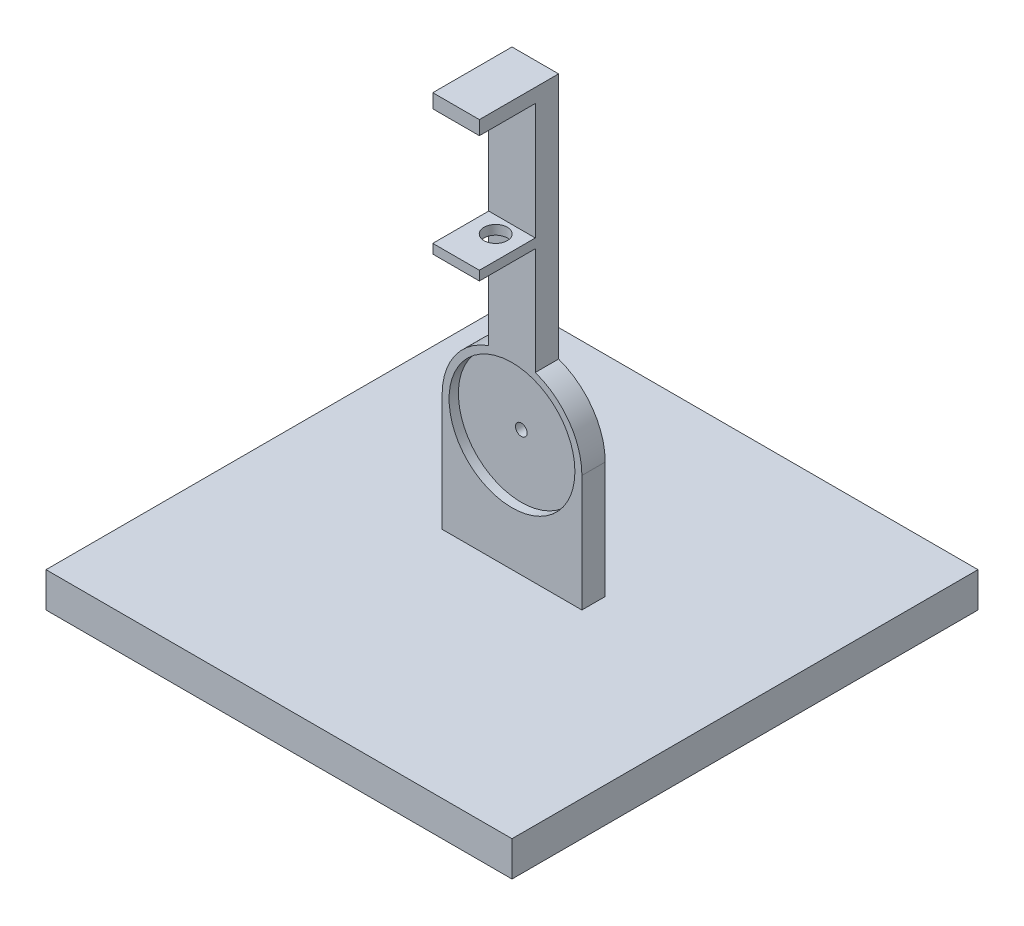
ISO-10303-21;
HEADER;
FILE_DESCRIPTION(('STEP AP214'),'2;1');
FILE_NAME('part.step','',(''),(''),'','','');
FILE_SCHEMA(('AUTOMOTIVE_DESIGN { 1 0 10303 214 1 1 1 1 }'));
ENDSEC;
DATA;
#1=APPLICATION_CONTEXT('core data for automotive mechanical design processes');
#2=APPLICATION_PROTOCOL_DEFINITION('international standard','automotive_design',2000,#1);
#3=PRODUCT_CONTEXT('',#1,'mechanical');
#4=PRODUCT('Part','Part','',(#3));
#5=PRODUCT_RELATED_PRODUCT_CATEGORY('part','',(#4));
#6=PRODUCT_DEFINITION_FORMATION('','',#4);
#7=PRODUCT_DEFINITION_CONTEXT('part definition',#1,'design');
#8=PRODUCT_DEFINITION('design','',#6,#7);
#9=PRODUCT_DEFINITION_SHAPE('','',#8);
#10=(LENGTH_UNIT() NAMED_UNIT(*) SI_UNIT(.MILLI.,.METRE.));
#11=(NAMED_UNIT(*) PLANE_ANGLE_UNIT() SI_UNIT($,.RADIAN.));
#12=(NAMED_UNIT(*) SI_UNIT($,.STERADIAN.) SOLID_ANGLE_UNIT());
#13=UNCERTAINTY_MEASURE_WITH_UNIT(LENGTH_MEASURE(1.E-05),#10,'distance_accuracy_value','');
#14=(GEOMETRIC_REPRESENTATION_CONTEXT(3) GLOBAL_UNCERTAINTY_ASSIGNED_CONTEXT((#13)) GLOBAL_UNIT_ASSIGNED_CONTEXT((#10,
#11,#12)) REPRESENTATION_CONTEXT('',''));
#15=CARTESIAN_POINT('',(0.,0.,0.));
#16=DIRECTION('',(0.,0.,1.));
#17=DIRECTION('',(1.,0.,0.));
#18=AXIS2_PLACEMENT_3D('',#15,#16,#17);
#19=CARTESIAN_POINT('',(50.,32.5,50.));
#20=DIRECTION('',(0.,0.,-1.));
#21=DIRECTION('',(-1.,0.,0.));
#22=AXIS2_PLACEMENT_3D('',#19,#20,#21);
#23=PLANE('',#22);
#24=DIRECTION('',(1.,0.,0.));
#25=VECTOR('',#24,1.);
#26=CARTESIAN_POINT('',(0.,71.642135623731,50.));
#27=LINE('',#26,#25);
#28=CARTESIAN_POINT('',(45.,71.642135623731,50.));
#29=VERTEX_POINT('',#28);
#30=CARTESIAN_POINT('',(55.,71.642135623731,50.));
#31=VERTEX_POINT('',#30);
#32=EDGE_CURVE('E64',#29,#31,#27,.T.);
#33=ORIENTED_EDGE('',*,*,#32,.T.);
#34=DIRECTION('',(0.,1.,0.));
#35=VECTOR('',#34,1.);
#36=CARTESIAN_POINT('',(55.,46.642135623731,50.));
#37=LINE('',#36,#35);
#38=CARTESIAN_POINT('',(55.,96.642135623731,50.));
#39=VERTEX_POINT('',#38);
#40=EDGE_CURVE('E236',#31,#39,#37,.T.);
#41=ORIENTED_EDGE('',*,*,#40,.T.);
#42=DIRECTION('',(1.,0.,0.));
#43=VECTOR('',#42,1.);
#44=CARTESIAN_POINT('',(45.,96.642135623731,50.));
#45=LINE('',#44,#43);
#46=CARTESIAN_POINT('',(45.,96.642135623731,50.));
#47=VERTEX_POINT('',#46);
#48=EDGE_CURVE('E239',#47,#39,#45,.T.);
#49=ORIENTED_EDGE('',*,*,#48,.F.);
#50=DIRECTION('',(0.,1.,0.));
#51=VECTOR('',#50,1.);
#52=CARTESIAN_POINT('',(45.,46.642135623731,50.));
#53=LINE('',#52,#51);
#54=EDGE_CURVE('E242',#29,#47,#53,.T.);
#55=ORIENTED_EDGE('',*,*,#54,.F.);
#56=EDGE_LOOP('',(#33,#41,#49,#55));
#57=FACE_BOUND('',#56,.T.);
#58=ADVANCED_FACE('F39',(#57),#23,.F.);
#59=CARTESIAN_POINT('',(0.,7.5,100.));
#60=DIRECTION('',(0.,1.,0.));
#61=DIRECTION('',(0.,0.,1.));
#62=AXIS2_PLACEMENT_3D('',#59,#60,#61);
#63=PLANE('',#62);
#64=DIRECTION('',(1.,0.,0.));
#65=VECTOR('',#64,1.);
#66=CARTESIAN_POINT('',(0.,7.5,0.));
#67=LINE('',#66,#65);
#68=CARTESIAN_POINT('',(0.,7.5,0.));
#69=VERTEX_POINT('',#68);
#70=CARTESIAN_POINT('',(100.,7.5,0.));
#71=VERTEX_POINT('',#70);
#72=EDGE_CURVE('E293',#69,#71,#67,.T.);
#73=ORIENTED_EDGE('',*,*,#72,.F.);
#74=DIRECTION('',(0.,0.,-1.));
#75=VECTOR('',#74,1.);
#76=CARTESIAN_POINT('',(0.,7.5,100.));
#77=LINE('',#76,#75);
#78=CARTESIAN_POINT('',(0.,7.5,100.));
#79=VERTEX_POINT('',#78);
#80=EDGE_CURVE('E43',#79,#69,#77,.T.);
#81=ORIENTED_EDGE('',*,*,#80,.F.);
#82=DIRECTION('',(1.,0.,0.));
#83=VECTOR('',#82,1.);
#84=CARTESIAN_POINT('',(0.,7.5,100.));
#85=LINE('',#84,#83);
#86=CARTESIAN_POINT('',(100.,7.5,100.));
#87=VERTEX_POINT('',#86);
#88=EDGE_CURVE('E283',#79,#87,#85,.T.);
#89=ORIENTED_EDGE('',*,*,#88,.T.);
#90=DIRECTION('',(0.,0.,-1.));
#91=VECTOR('',#90,1.);
#92=CARTESIAN_POINT('',(100.,7.5,100.));
#93=LINE('',#92,#91);
#94=EDGE_CURVE('E301',#87,#71,#93,.T.);
#95=ORIENTED_EDGE('',*,*,#94,.T.);
#96=EDGE_LOOP('',(#73,#81,#89,#95));
#97=FACE_BOUND('',#96,.T.);
#98=DIRECTION('',(0.,0.,-1.));
#99=VECTOR('',#98,1.);
#100=CARTESIAN_POINT('',(65.,7.5,50.));
#101=LINE('',#100,#99);
#102=CARTESIAN_POINT('',(65.,7.5,50.));
#103=VERTEX_POINT('',#102);
#104=CARTESIAN_POINT('',(65.,7.5,45.));
#105=VERTEX_POINT('',#104);
#106=EDGE_CURVE('E276',#103,#105,#101,.T.);
#107=ORIENTED_EDGE('',*,*,#106,.F.);
#108=DIRECTION('',(1.,0.,0.));
#109=VECTOR('',#108,1.);
#110=CARTESIAN_POINT('',(35.,7.5,50.));
#111=LINE('',#110,#109);
#112=CARTESIAN_POINT('',(35.,7.5,50.));
#113=VERTEX_POINT('',#112);
#114=EDGE_CURVE('E227',#113,#103,#111,.T.);
#115=ORIENTED_EDGE('',*,*,#114,.F.);
#116=DIRECTION('',(0.,0.,-1.));
#117=VECTOR('',#116,1.);
#118=CARTESIAN_POINT('',(35.,7.5,50.));
#119=LINE('',#118,#117);
#120=CARTESIAN_POINT('',(35.,7.5,45.));
#121=VERTEX_POINT('',#120);
#122=EDGE_CURVE('E250',#113,#121,#119,.T.);
#123=ORIENTED_EDGE('',*,*,#122,.T.);
#124=DIRECTION('',(1.,0.,0.));
#125=VECTOR('',#124,1.);
#126=CARTESIAN_POINT('',(35.,7.5,45.));
#127=LINE('',#126,#125);
#128=EDGE_CURVE('E224',#121,#105,#127,.T.);
#129=ORIENTED_EDGE('',*,*,#128,.T.);
#130=EDGE_LOOP('',(#107,#115,#123,#129));
#131=FACE_BOUND('',#130,.T.);
#132=ADVANCED_FACE('F309',(#97,#131),#63,.T.);
#133=CARTESIAN_POINT('',(0.,0.,100.));
#134=DIRECTION('',(-1.,0.,0.));
#135=DIRECTION('',(0.,0.,1.));
#136=AXIS2_PLACEMENT_3D('',#133,#134,#135);
#137=PLANE('',#136);
#138=DIRECTION('',(0.,1.,0.));
#139=VECTOR('',#138,1.);
#140=CARTESIAN_POINT('',(0.,0.,0.));
#141=LINE('',#140,#139);
#142=CARTESIAN_POINT('',(0.,0.,0.));
#143=VERTEX_POINT('',#142);
#144=EDGE_CURVE('E279',#143,#69,#141,.T.);
#145=ORIENTED_EDGE('',*,*,#144,.F.);
#146=DIRECTION('',(0.,0.,-1.));
#147=VECTOR('',#146,1.);
#148=CARTESIAN_POINT('',(0.,0.,100.));
#149=LINE('',#148,#147);
#150=CARTESIAN_POINT('',(0.,0.,100.));
#151=VERTEX_POINT('',#150);
#152=EDGE_CURVE('E11',#151,#143,#149,.T.);
#153=ORIENTED_EDGE('',*,*,#152,.F.);
#154=DIRECTION('',(0.,1.,0.));
#155=VECTOR('',#154,1.);
#156=CARTESIAN_POINT('',(0.,0.,100.));
#157=LINE('',#156,#155);
#158=EDGE_CURVE('E280',#151,#79,#157,.T.);
#159=ORIENTED_EDGE('',*,*,#158,.T.);
#160=ORIENTED_EDGE('',*,*,#80,.T.);
#161=EDGE_LOOP('',(#145,#153,#159,#160));
#162=FACE_BOUND('',#161,.T.);
#163=ADVANCED_FACE('F41',(#162),#137,.T.);
#164=CARTESIAN_POINT('',(0.,0.,100.));
#165=DIRECTION('',(0.,1.,0.));
#166=DIRECTION('',(0.,0.,1.));
#167=AXIS2_PLACEMENT_3D('',#164,#165,#166);
#168=PLANE('',#167);
#169=DIRECTION('',(1.,0.,0.));
#170=VECTOR('',#169,1.);
#171=CARTESIAN_POINT('',(0.,0.,0.));
#172=LINE('',#171,#170);
#173=CARTESIAN_POINT('',(100.,0.,0.));
#174=VERTEX_POINT('',#173);
#175=EDGE_CURVE('E284',#143,#174,#172,.T.);
#176=ORIENTED_EDGE('',*,*,#175,.T.);
#177=DIRECTION('',(0.,0.,-1.));
#178=VECTOR('',#177,1.);
#179=CARTESIAN_POINT('',(100.,0.,100.));
#180=LINE('',#179,#178);
#181=CARTESIAN_POINT('',(100.,0.,100.));
#182=VERTEX_POINT('',#181);
#183=EDGE_CURVE('E48',#182,#174,#180,.T.);
#184=ORIENTED_EDGE('',*,*,#183,.F.);
#185=DIRECTION('',(1.,0.,0.));
#186=VECTOR('',#185,1.);
#187=CARTESIAN_POINT('',(0.,0.,100.));
#188=LINE('',#187,#186);
#189=EDGE_CURVE('E289',#151,#182,#188,.T.);
#190=ORIENTED_EDGE('',*,*,#189,.F.);
#191=ORIENTED_EDGE('',*,*,#152,.T.);
#192=EDGE_LOOP('',(#176,#184,#190,#191));
#193=FACE_BOUND('',#192,.T.);
#194=ADVANCED_FACE('F317',(#193),#168,.F.);
#195=CARTESIAN_POINT('',(100.,0.,100.));
#196=DIRECTION('',(-1.,0.,0.));
#197=DIRECTION('',(0.,0.,1.));
#198=AXIS2_PLACEMENT_3D('',#195,#196,#197);
#199=PLANE('',#198);
#200=DIRECTION('',(0.,1.,0.));
#201=VECTOR('',#200,1.);
#202=CARTESIAN_POINT('',(100.,0.,0.));
#203=LINE('',#202,#201);
#204=EDGE_CURVE('E296',#174,#71,#203,.T.);
#205=ORIENTED_EDGE('',*,*,#204,.T.);
#206=ORIENTED_EDGE('',*,*,#94,.F.);
#207=DIRECTION('',(0.,1.,0.));
#208=VECTOR('',#207,1.);
#209=CARTESIAN_POINT('',(100.,0.,100.));
#210=LINE('',#209,#208);
#211=EDGE_CURVE('E287',#182,#87,#210,.T.);
#212=ORIENTED_EDGE('',*,*,#211,.F.);
#213=ORIENTED_EDGE('',*,*,#183,.T.);
#214=EDGE_LOOP('',(#205,#206,#212,#213));
#215=FACE_BOUND('',#214,.T.);
#216=ADVANCED_FACE('F321',(#215),#199,.F.);
#217=CARTESIAN_POINT('',(0.,0.,100.));
#218=DIRECTION('',(0.,0.,-1.));
#219=DIRECTION('',(-1.,0.,0.));
#220=AXIS2_PLACEMENT_3D('',#217,#218,#219);
#221=PLANE('',#220);
#222=ORIENTED_EDGE('',*,*,#158,.F.);
#223=ORIENTED_EDGE('',*,*,#189,.T.);
#224=ORIENTED_EDGE('',*,*,#211,.T.);
#225=ORIENTED_EDGE('',*,*,#88,.F.);
#226=EDGE_LOOP('',(#222,#223,#224,#225));
#227=FACE_BOUND('',#226,.T.);
#228=ADVANCED_FACE('F323',(#227),#221,.F.);
#229=CARTESIAN_POINT('',(0.,0.,0.));
#230=DIRECTION('',(0.,0.,-1.));
#231=DIRECTION('',(-1.,0.,0.));
#232=AXIS2_PLACEMENT_3D('',#229,#230,#231);
#233=PLANE('',#232);
#234=ORIENTED_EDGE('',*,*,#144,.T.);
#235=ORIENTED_EDGE('',*,*,#72,.T.);
#236=ORIENTED_EDGE('',*,*,#204,.F.);
#237=ORIENTED_EDGE('',*,*,#175,.F.);
#238=EDGE_LOOP('',(#234,#235,#236,#237));
#239=FACE_BOUND('',#238,.T.);
#240=ADVANCED_FACE('F314',(#239),#233,.T.);
#241=CARTESIAN_POINT('',(65.,7.5,50.));
#242=DIRECTION('',(-1.,0.,0.));
#243=DIRECTION('',(0.,0.,1.));
#244=AXIS2_PLACEMENT_3D('',#241,#242,#243);
#245=PLANE('',#244);
#246=DIRECTION('',(0.,1.,0.));
#247=VECTOR('',#246,1.);
#248=CARTESIAN_POINT('',(65.,7.5,45.));
#249=LINE('',#248,#247);
#250=CARTESIAN_POINT('',(65.,32.5,45.));
#251=VERTEX_POINT('',#250);
#252=EDGE_CURVE('E252',#105,#251,#249,.T.);
#253=ORIENTED_EDGE('',*,*,#252,.T.);
#254=DIRECTION('',(0.,0.,-1.));
#255=VECTOR('',#254,1.);
#256=CARTESIAN_POINT('',(65.,32.5,50.));
#257=LINE('',#256,#255);
#258=CARTESIAN_POINT('',(65.,32.5,50.));
#259=VERTEX_POINT('',#258);
#260=EDGE_CURVE('E274',#259,#251,#257,.T.);
#261=ORIENTED_EDGE('',*,*,#260,.F.);
#262=DIRECTION('',(0.,1.,0.));
#263=VECTOR('',#262,1.);
#264=CARTESIAN_POINT('',(65.,7.5,50.));
#265=LINE('',#264,#263);
#266=EDGE_CURVE('E230',#103,#259,#265,.T.);
#267=ORIENTED_EDGE('',*,*,#266,.F.);
#268=ORIENTED_EDGE('',*,*,#106,.T.);
#269=EDGE_LOOP('',(#253,#261,#267,#268));
#270=FACE_BOUND('',#269,.T.);
#271=ADVANCED_FACE('F330',(#270),#245,.F.);
#272=CARTESIAN_POINT('',(50.,32.5,50.));
#273=DIRECTION('',(0.,0.,-1.));
#274=DIRECTION('',(-1.,0.,0.));
#275=AXIS2_PLACEMENT_3D('',#272,#273,#274);
#276=CYLINDRICAL_SURFACE('',#275,15.);
#277=CARTESIAN_POINT('',(50.,32.5,45.));
#278=DIRECTION('',(0.,0.,-1.));
#279=DIRECTION('',(-1.,0.,0.));
#280=AXIS2_PLACEMENT_3D('',#277,#278,#279);
#281=CIRCLE('',#280,15.);
#282=CARTESIAN_POINT('',(55.,46.642135623731,45.));
#283=VERTEX_POINT('',#282);
#284=EDGE_CURVE('E255',#283,#251,#281,.T.);
#285=ORIENTED_EDGE('',*,*,#284,.F.);
#286=DIRECTION('',(0.,0.,-1.));
#287=VECTOR('',#286,1.);
#288=CARTESIAN_POINT('',(55.,46.642135623731,50.));
#289=LINE('',#288,#287);
#290=CARTESIAN_POINT('',(55.,46.642135623731,50.));
#291=VERTEX_POINT('',#290);
#292=EDGE_CURVE('E272',#291,#283,#289,.T.);
#293=ORIENTED_EDGE('',*,*,#292,.F.);
#294=CARTESIAN_POINT('',(50.,32.5,50.));
#295=DIRECTION('',(0.,0.,-1.));
#296=DIRECTION('',(-1.,0.,0.));
#297=AXIS2_PLACEMENT_3D('',#294,#295,#296);
#298=CIRCLE('',#297,15.);
#299=EDGE_CURVE('E233',#291,#259,#298,.T.);
#300=ORIENTED_EDGE('',*,*,#299,.T.);
#301=ORIENTED_EDGE('',*,*,#260,.T.);
#302=EDGE_LOOP('',(#285,#293,#300,#301));
#303=FACE_BOUND('',#302,.T.);
#304=ADVANCED_FACE('F445',(#303),#276,.T.);
#305=CARTESIAN_POINT('',(55.,46.642135623731,50.));
#306=DIRECTION('',(-1.,0.,0.));
#307=DIRECTION('',(0.,0.,1.));
#308=AXIS2_PLACEMENT_3D('',#305,#306,#307);
#309=PLANE('',#308);
#310=DIRECTION('',(0.,1.,0.));
#311=VECTOR('',#310,1.);
#312=CARTESIAN_POINT('',(55.,46.642135623731,45.));
#313=LINE('',#312,#311);
#314=CARTESIAN_POINT('',(55.,99.642135623731,45.));
#315=VERTEX_POINT('',#314);
#316=EDGE_CURVE('E258',#283,#315,#313,.T.);
#317=ORIENTED_EDGE('',*,*,#316,.T.);
#318=DIRECTION('',(0.,0.,-1.));
#319=VECTOR('',#318,1.);
#320=CARTESIAN_POINT('',(55.,99.642135623731,62.));
#321=LINE('',#320,#319);
#322=CARTESIAN_POINT('',(55.,99.642135623731,62.));
#323=VERTEX_POINT('',#322);
#324=EDGE_CURVE('E217',#323,#315,#321,.T.);
#325=ORIENTED_EDGE('',*,*,#324,.F.);
#326=DIRECTION('',(0.,1.,0.));
#327=VECTOR('',#326,1.);
#328=CARTESIAN_POINT('',(55.,96.642135623731,62.));
#329=LINE('',#328,#327);
#330=CARTESIAN_POINT('',(55.,96.642135623731,62.));
#331=VERTEX_POINT('',#330);
#332=EDGE_CURVE('E193',#331,#323,#329,.T.);
#333=ORIENTED_EDGE('',*,*,#332,.F.);
#334=DIRECTION('',(0.,0.,-1.));
#335=VECTOR('',#334,1.);
#336=CARTESIAN_POINT('',(55.,96.642135623731,62.));
#337=LINE('',#336,#335);
#338=EDGE_CURVE('E207',#331,#39,#337,.T.);
#339=ORIENTED_EDGE('',*,*,#338,.T.);
#340=ORIENTED_EDGE('',*,*,#40,.F.);
#341=DIRECTION('',(0.,0.,-1.));
#342=VECTOR('',#341,1.);
#343=CARTESIAN_POINT('',(55.,71.642135623731,0.));
#344=LINE('',#343,#342);
#345=CARTESIAN_POINT('',(55.,71.642135623731,62.));
#346=VERTEX_POINT('',#345);
#347=EDGE_CURVE('E371',#346,#31,#344,.T.);
#348=ORIENTED_EDGE('',*,*,#347,.F.);
#349=DIRECTION('',(0.,1.,0.));
#350=VECTOR('',#349,1.);
#351=CARTESIAN_POINT('',(55.,69.642135623731,62.));
#352=LINE('',#351,#350);
#353=CARTESIAN_POINT('',(55.,69.642135623731,62.));
#354=VERTEX_POINT('',#353);
#355=EDGE_CURVE('E190',#354,#346,#352,.T.);
#356=ORIENTED_EDGE('',*,*,#355,.F.);
#357=DIRECTION('',(0.,0.,-1.));
#358=VECTOR('',#357,1.);
#359=CARTESIAN_POINT('',(55.,69.642135623731,0.));
#360=LINE('',#359,#358);
#361=CARTESIAN_POINT('',(55.,69.642135623731,50.));
#362=VERTEX_POINT('',#361);
#363=EDGE_CURVE('E182',#354,#362,#360,.T.);
#364=ORIENTED_EDGE('',*,*,#363,.T.);
#365=EDGE_CURVE('E237',#291,#362,#37,.T.);
#366=ORIENTED_EDGE('',*,*,#365,.F.);
#367=ORIENTED_EDGE('',*,*,#292,.T.);
#368=EDGE_LOOP('',(#317,#325,#333,#339,#340,#348,#356,#364,#366,#367));
#369=FACE_BOUND('',#368,.T.);
#370=ADVANCED_FACE('F360',(#369),#309,.F.);
#371=CARTESIAN_POINT('',(45.,46.642135623731,50.));
#372=DIRECTION('',(-1.,0.,0.));
#373=DIRECTION('',(0.,-1.,0.));
#374=AXIS2_PLACEMENT_3D('',#371,#372,#373);
#375=PLANE('',#374);
#376=DIRECTION('',(0.,1.,0.));
#377=VECTOR('',#376,1.);
#378=CARTESIAN_POINT('',(45.,46.642135623731,45.));
#379=LINE('',#378,#377);
#380=CARTESIAN_POINT('',(45.,46.642135623731,45.));
#381=VERTEX_POINT('',#380);
#382=CARTESIAN_POINT('',(45.,99.642135623731,45.));
#383=VERTEX_POINT('',#382);
#384=EDGE_CURVE('E260',#381,#383,#379,.T.);
#385=ORIENTED_EDGE('',*,*,#384,.F.);
#386=DIRECTION('',(0.,0.,-1.));
#387=VECTOR('',#386,1.);
#388=CARTESIAN_POINT('',(45.,46.642135623731,50.));
#389=LINE('',#388,#387);
#390=CARTESIAN_POINT('',(45.,46.642135623731,50.));
#391=VERTEX_POINT('',#390);
#392=EDGE_CURVE('E270',#391,#381,#389,.T.);
#393=ORIENTED_EDGE('',*,*,#392,.F.);
#394=CARTESIAN_POINT('',(45.,69.642135623731,50.));
#395=VERTEX_POINT('',#394);
#396=EDGE_CURVE('E174',#391,#395,#53,.T.);
#397=ORIENTED_EDGE('',*,*,#396,.T.);
#398=DIRECTION('',(0.,0.,-1.));
#399=VECTOR('',#398,1.);
#400=CARTESIAN_POINT('',(45.,69.642135623731,0.));
#401=LINE('',#400,#399);
#402=CARTESIAN_POINT('',(45.,69.642135623731,62.));
#403=VERTEX_POINT('',#402);
#404=EDGE_CURVE('E166',#403,#395,#401,.T.);
#405=ORIENTED_EDGE('',*,*,#404,.F.);
#406=DIRECTION('',(0.,1.,0.));
#407=VECTOR('',#406,1.);
#408=CARTESIAN_POINT('',(45.,69.642135623731,62.));
#409=LINE('',#408,#407);
#410=CARTESIAN_POINT('',(45.,71.642135623731,62.));
#411=VERTEX_POINT('',#410);
#412=EDGE_CURVE('E172',#403,#411,#409,.T.);
#413=ORIENTED_EDGE('',*,*,#412,.T.);
#414=DIRECTION('',(0.,0.,-1.));
#415=VECTOR('',#414,1.);
#416=CARTESIAN_POINT('',(45.,71.642135623731,0.));
#417=LINE('',#416,#415);
#418=EDGE_CURVE('E369',#411,#29,#417,.T.);
#419=ORIENTED_EDGE('',*,*,#418,.T.);
#420=ORIENTED_EDGE('',*,*,#54,.T.);
#421=DIRECTION('',(0.,0.,-1.));
#422=VECTOR('',#421,1.);
#423=CARTESIAN_POINT('',(45.,96.642135623731,62.));
#424=LINE('',#423,#422);
#425=CARTESIAN_POINT('',(45.,96.642135623731,62.));
#426=VERTEX_POINT('',#425);
#427=EDGE_CURVE('E211',#426,#47,#424,.T.);
#428=ORIENTED_EDGE('',*,*,#427,.F.);
#429=DIRECTION('',(0.,1.,0.));
#430=VECTOR('',#429,1.);
#431=CARTESIAN_POINT('',(45.,96.642135623731,62.));
#432=LINE('',#431,#430);
#433=CARTESIAN_POINT('',(45.,99.642135623731,62.));
#434=VERTEX_POINT('',#433);
#435=EDGE_CURVE('E202',#426,#434,#432,.T.);
#436=ORIENTED_EDGE('',*,*,#435,.T.);
#437=DIRECTION('',(0.,0.,-1.));
#438=VECTOR('',#437,1.);
#439=CARTESIAN_POINT('',(45.,99.642135623731,62.));
#440=LINE('',#439,#438);
#441=EDGE_CURVE('E214',#434,#383,#440,.T.);
#442=ORIENTED_EDGE('',*,*,#441,.T.);
#443=EDGE_LOOP('',(#385,#393,#397,#405,#413,#419,#420,#428,#436,#442));
#444=FACE_BOUND('',#443,.T.);
#445=ADVANCED_FACE('F169',(#444),#375,.T.);
#446=CARTESIAN_POINT('',(50.,32.5,50.));
#447=DIRECTION('',(0.,0.,-1.));
#448=DIRECTION('',(-1.,0.,0.));
#449=AXIS2_PLACEMENT_3D('',#446,#447,#448);
#450=CYLINDRICAL_SURFACE('',#449,15.);
#451=CARTESIAN_POINT('',(50.,32.5,45.));
#452=DIRECTION('',(0.,0.,-1.));
#453=DIRECTION('',(-1.,0.,0.));
#454=AXIS2_PLACEMENT_3D('',#451,#452,#453);
#455=CIRCLE('',#454,15.);
#456=CARTESIAN_POINT('',(35.,32.5,45.));
#457=VERTEX_POINT('',#456);
#458=EDGE_CURVE('E262',#457,#381,#455,.T.);
#459=ORIENTED_EDGE('',*,*,#458,.F.);
#460=DIRECTION('',(0.,0.,-1.));
#461=VECTOR('',#460,1.);
#462=CARTESIAN_POINT('',(35.,32.5,50.));
#463=LINE('',#462,#461);
#464=CARTESIAN_POINT('',(35.,32.5,50.));
#465=VERTEX_POINT('',#464);
#466=EDGE_CURVE('E268',#465,#457,#463,.T.);
#467=ORIENTED_EDGE('',*,*,#466,.F.);
#468=CARTESIAN_POINT('',(50.,32.5,50.));
#469=DIRECTION('',(0.,0.,-1.));
#470=DIRECTION('',(-1.,0.,0.));
#471=AXIS2_PLACEMENT_3D('',#468,#469,#470);
#472=CIRCLE('',#471,15.);
#473=EDGE_CURVE('E244',#465,#391,#472,.T.);
#474=ORIENTED_EDGE('',*,*,#473,.T.);
#475=ORIENTED_EDGE('',*,*,#392,.T.);
#476=EDGE_LOOP('',(#459,#467,#474,#475));
#477=FACE_BOUND('',#476,.T.);
#478=ADVANCED_FACE('F352',(#477),#450,.T.);
#479=CARTESIAN_POINT('',(35.,7.5,50.));
#480=DIRECTION('',(-1.,0.,0.));
#481=DIRECTION('',(0.,0.,1.));
#482=AXIS2_PLACEMENT_3D('',#479,#480,#481);
#483=PLANE('',#482);
#484=DIRECTION('',(0.,1.,0.));
#485=VECTOR('',#484,1.);
#486=CARTESIAN_POINT('',(35.,7.5,45.));
#487=LINE('',#486,#485);
#488=EDGE_CURVE('E231',#121,#457,#487,.T.);
#489=ORIENTED_EDGE('',*,*,#488,.F.);
#490=ORIENTED_EDGE('',*,*,#122,.F.);
#491=DIRECTION('',(0.,1.,0.));
#492=VECTOR('',#491,1.);
#493=CARTESIAN_POINT('',(35.,7.5,50.));
#494=LINE('',#493,#492);
#495=EDGE_CURVE('E247',#113,#465,#494,.T.);
#496=ORIENTED_EDGE('',*,*,#495,.T.);
#497=ORIENTED_EDGE('',*,*,#466,.T.);
#498=EDGE_LOOP('',(#489,#490,#496,#497));
#499=FACE_BOUND('',#498,.T.);
#500=ADVANCED_FACE('F344',(#499),#483,.T.);
#501=CARTESIAN_POINT('',(50.,32.5,50.));
#502=DIRECTION('',(0.,0.,1.));
#503=DIRECTION('',(1.,0.,0.));
#504=AXIS2_PLACEMENT_3D('',#501,#502,#503);
#505=CIRCLE('',#504,13.5);
#506=CARTESIAN_POINT('',(63.5,32.5,50.));
#507=VERTEX_POINT('',#506);
#508=EDGE_CURVE('E220',#507,#507,#505,.T.);
#509=ORIENTED_EDGE('',*,*,#508,.F.);
#510=EDGE_LOOP('',(#509));
#511=FACE_BOUND('',#510,.T.);
#512=ORIENTED_EDGE('',*,*,#365,.T.);
#513=DIRECTION('',(1.,0.,0.));
#514=VECTOR('',#513,1.);
#515=CARTESIAN_POINT('',(0.,69.642135623731,50.));
#516=LINE('',#515,#514);
#517=EDGE_CURVE('E56',#395,#362,#516,.T.);
#518=ORIENTED_EDGE('',*,*,#517,.F.);
#519=ORIENTED_EDGE('',*,*,#396,.F.);
#520=ORIENTED_EDGE('',*,*,#473,.F.);
#521=ORIENTED_EDGE('',*,*,#495,.F.);
#522=ORIENTED_EDGE('',*,*,#114,.T.);
#523=ORIENTED_EDGE('',*,*,#266,.T.);
#524=ORIENTED_EDGE('',*,*,#299,.F.);
#525=EDGE_LOOP('',(#512,#518,#519,#520,#521,#522,#523,#524));
#526=FACE_BOUND('',#525,.T.);
#527=ADVANCED_FACE('F336',(#511,#526),#23,.F.);
#528=CARTESIAN_POINT('',(50.,32.5,45.));
#529=DIRECTION('',(0.,0.,-1.));
#530=DIRECTION('',(-1.,0.,0.));
#531=AXIS2_PLACEMENT_3D('',#528,#529,#530);
#532=PLANE('',#531);
#533=CARTESIAN_POINT('',(50.,32.5,45.));
#534=DIRECTION('',(0.,0.,-1.));
#535=DIRECTION('',(-1.,0.,0.));
#536=AXIS2_PLACEMENT_3D('',#533,#534,#535);
#537=CIRCLE('',#536,1.25);
#538=CARTESIAN_POINT('',(48.75,32.5,45.));
#539=VERTEX_POINT('',#538);
#540=EDGE_CURVE('E379',#539,#539,#537,.F.);
#541=ORIENTED_EDGE('',*,*,#540,.T.);
#542=EDGE_LOOP('',(#541));
#543=FACE_BOUND('',#542,.T.);
#544=ORIENTED_EDGE('',*,*,#128,.F.);
#545=ORIENTED_EDGE('',*,*,#488,.T.);
#546=ORIENTED_EDGE('',*,*,#458,.T.);
#547=ORIENTED_EDGE('',*,*,#384,.T.);
#548=DIRECTION('',(-1.,0.,0.));
#549=VECTOR('',#548,1.);
#550=CARTESIAN_POINT('',(55.,99.642135623731,45.));
#551=LINE('',#550,#549);
#552=EDGE_CURVE('E189',#315,#383,#551,.T.);
#553=ORIENTED_EDGE('',*,*,#552,.F.);
#554=ORIENTED_EDGE('',*,*,#316,.F.);
#555=ORIENTED_EDGE('',*,*,#284,.T.);
#556=ORIENTED_EDGE('',*,*,#252,.F.);
#557=EDGE_LOOP('',(#544,#545,#546,#547,#553,#554,#555,#556));
#558=FACE_BOUND('',#557,.T.);
#559=ADVANCED_FACE('F343',(#543,#558),#532,.T.);
#560=CARTESIAN_POINT('',(50.,32.5,48.));
#561=DIRECTION('',(0.,0.,1.));
#562=DIRECTION('',(1.,0.,0.));
#563=AXIS2_PLACEMENT_3D('',#560,#561,#562);
#564=CYLINDRICAL_SURFACE('',#563,13.5);
#565=CARTESIAN_POINT('',(50.,32.5,48.));
#566=DIRECTION('',(0.,0.,1.));
#567=DIRECTION('',(1.,0.,0.));
#568=AXIS2_PLACEMENT_3D('',#565,#566,#567);
#569=CIRCLE('',#568,13.5);
#570=CARTESIAN_POINT('',(63.5,32.5,48.));
#571=VERTEX_POINT('',#570);
#572=EDGE_CURVE('E221',#571,#571,#569,.T.);
#573=ORIENTED_EDGE('',*,*,#572,.F.);
#574=EDGE_LOOP('',(#573));
#575=FACE_BOUND('',#574,.T.);
#576=ORIENTED_EDGE('',*,*,#508,.T.);
#577=EDGE_LOOP('',(#576));
#578=FACE_BOUND('',#577,.T.);
#579=ADVANCED_FACE('F350',(#575,#578),#564,.F.);
#580=CARTESIAN_POINT('',(50.,32.5,48.));
#581=DIRECTION('',(0.,0.,1.));
#582=DIRECTION('',(1.,0.,0.));
#583=AXIS2_PLACEMENT_3D('',#580,#581,#582);
#584=PLANE('',#583);
#585=CARTESIAN_POINT('',(50.,32.5,48.));
#586=DIRECTION('',(0.,0.,1.));
#587=DIRECTION('',(1.,0.,0.));
#588=AXIS2_PLACEMENT_3D('',#585,#586,#587);
#589=CIRCLE('',#588,1.25);
#590=CARTESIAN_POINT('',(51.25,32.5,48.));
#591=VERTEX_POINT('',#590);
#592=EDGE_CURVE('E367',#591,#591,#589,.T.);
#593=ORIENTED_EDGE('',*,*,#592,.F.);
#594=EDGE_LOOP('',(#593));
#595=FACE_BOUND('',#594,.T.);
#596=ORIENTED_EDGE('',*,*,#572,.T.);
#597=EDGE_LOOP('',(#596));
#598=FACE_BOUND('',#597,.T.);
#599=ADVANCED_FACE('F387',(#595,#598),#584,.T.);
#600=CARTESIAN_POINT('',(55.,99.642135623731,62.));
#601=DIRECTION('',(0.,-1.,0.));
#602=DIRECTION('',(0.,0.,-1.));
#603=AXIS2_PLACEMENT_3D('',#600,#601,#602);
#604=PLANE('',#603);
#605=ORIENTED_EDGE('',*,*,#552,.T.);
#606=ORIENTED_EDGE('',*,*,#441,.F.);
#607=DIRECTION('',(-1.,0.,0.));
#608=VECTOR('',#607,1.);
#609=CARTESIAN_POINT('',(55.,99.642135623731,62.));
#610=LINE('',#609,#608);
#611=EDGE_CURVE('E200',#323,#434,#610,.T.);
#612=ORIENTED_EDGE('',*,*,#611,.F.);
#613=ORIENTED_EDGE('',*,*,#324,.T.);
#614=EDGE_LOOP('',(#605,#606,#612,#613));
#615=FACE_BOUND('',#614,.T.);
#616=ADVANCED_FACE('F390',(#615),#604,.F.);
#617=CARTESIAN_POINT('',(55.,96.642135623731,62.));
#618=DIRECTION('',(0.,-1.,0.));
#619=DIRECTION('',(0.,0.,-1.));
#620=AXIS2_PLACEMENT_3D('',#617,#618,#619);
#621=PLANE('',#620);
#622=ORIENTED_EDGE('',*,*,#427,.T.);
#623=ORIENTED_EDGE('',*,*,#48,.T.);
#624=ORIENTED_EDGE('',*,*,#338,.F.);
#625=DIRECTION('',(-1.,0.,0.));
#626=VECTOR('',#625,1.);
#627=CARTESIAN_POINT('',(55.,96.642135623731,62.));
#628=LINE('',#627,#626);
#629=EDGE_CURVE('E205',#331,#426,#628,.T.);
#630=ORIENTED_EDGE('',*,*,#629,.T.);
#631=EDGE_LOOP('',(#622,#623,#624,#630));
#632=FACE_BOUND('',#631,.T.);
#633=ADVANCED_FACE('F401',(#632),#621,.T.);
#634=CARTESIAN_POINT('',(0.,0.,62.));
#635=DIRECTION('',(0.,0.,1.));
#636=DIRECTION('',(1.,0.,0.));
#637=AXIS2_PLACEMENT_3D('',#634,#635,#636);
#638=PLANE('',#637);
#639=ORIENTED_EDGE('',*,*,#332,.T.);
#640=ORIENTED_EDGE('',*,*,#611,.T.);
#641=ORIENTED_EDGE('',*,*,#435,.F.);
#642=ORIENTED_EDGE('',*,*,#629,.F.);
#643=EDGE_LOOP('',(#639,#640,#641,#642));
#644=FACE_BOUND('',#643,.T.);
#645=ADVANCED_FACE('F405',(#644),#638,.T.);
#646=CARTESIAN_POINT('',(0.,69.642135623731,62.));
#647=DIRECTION('',(0.,0.,-1.));
#648=DIRECTION('',(-1.,0.,0.));
#649=AXIS2_PLACEMENT_3D('',#646,#647,#648);
#650=PLANE('',#649);
#651=DIRECTION('',(-1.,0.,0.));
#652=VECTOR('',#651,1.);
#653=CARTESIAN_POINT('',(0.,71.642135623731,62.));
#654=LINE('',#653,#652);
#655=EDGE_CURVE('E188',#346,#411,#654,.T.);
#656=ORIENTED_EDGE('',*,*,#655,.T.);
#657=ORIENTED_EDGE('',*,*,#412,.F.);
#658=DIRECTION('',(-1.,0.,0.));
#659=VECTOR('',#658,1.);
#660=CARTESIAN_POINT('',(0.,69.642135623731,62.));
#661=LINE('',#660,#659);
#662=EDGE_CURVE('E176',#354,#403,#661,.T.);
#663=ORIENTED_EDGE('',*,*,#662,.F.);
#664=ORIENTED_EDGE('',*,*,#355,.T.);
#665=EDGE_LOOP('',(#656,#657,#663,#664));
#666=FACE_BOUND('',#665,.T.);
#667=ADVANCED_FACE('F186',(#666),#650,.F.);
#668=CARTESIAN_POINT('',(50.,69.642135623731,53.5));
#669=DIRECTION('',(0.,1.,0.));
#670=DIRECTION('',(0.,0.,1.));
#671=AXIS2_PLACEMENT_3D('',#668,#669,#670);
#672=CYLINDRICAL_SURFACE('',#671,2.5);
#673=CARTESIAN_POINT('',(50.,69.642135623731,53.5));
#674=DIRECTION('',(0.,-1.,0.));
#675=DIRECTION('',(0.,0.,-1.));
#676=AXIS2_PLACEMENT_3D('',#673,#674,#675);
#677=CIRCLE('',#676,2.5);
#678=CARTESIAN_POINT('',(50.,69.642135623731,51.));
#679=VERTEX_POINT('',#678);
#680=EDGE_CURVE('E184',#679,#679,#677,.T.);
#681=ORIENTED_EDGE('',*,*,#680,.T.);
#682=EDGE_LOOP('',(#681));
#683=FACE_BOUND('',#682,.T.);
#684=CARTESIAN_POINT('',(50.,71.642135623731,53.5));
#685=DIRECTION('',(0.,-1.,0.));
#686=DIRECTION('',(0.,0.,-1.));
#687=AXIS2_PLACEMENT_3D('',#684,#685,#686);
#688=CIRCLE('',#687,2.5);
#689=CARTESIAN_POINT('',(50.,71.642135623731,51.));
#690=VERTEX_POINT('',#689);
#691=EDGE_CURVE('E364',#690,#690,#688,.T.);
#692=ORIENTED_EDGE('',*,*,#691,.F.);
#693=EDGE_LOOP('',(#692));
#694=FACE_BOUND('',#693,.T.);
#695=ADVANCED_FACE('F410',(#683,#694),#672,.F.);
#696=CARTESIAN_POINT('',(0.,69.642135623731,0.));
#697=DIRECTION('',(0.,-1.,0.));
#698=DIRECTION('',(0.,0.,-1.));
#699=AXIS2_PLACEMENT_3D('',#696,#697,#698);
#700=PLANE('',#699);
#701=ORIENTED_EDGE('',*,*,#680,.F.);
#702=EDGE_LOOP('',(#701));
#703=FACE_BOUND('',#702,.T.);
#704=ORIENTED_EDGE('',*,*,#662,.T.);
#705=ORIENTED_EDGE('',*,*,#404,.T.);
#706=ORIENTED_EDGE('',*,*,#517,.T.);
#707=ORIENTED_EDGE('',*,*,#363,.F.);
#708=EDGE_LOOP('',(#704,#705,#706,#707));
#709=FACE_BOUND('',#708,.T.);
#710=ADVANCED_FACE('F180',(#703,#709),#700,.T.);
#711=CARTESIAN_POINT('',(0.,71.642135623731,0.));
#712=DIRECTION('',(0.,-1.,0.));
#713=DIRECTION('',(0.,0.,-1.));
#714=AXIS2_PLACEMENT_3D('',#711,#712,#713);
#715=PLANE('',#714);
#716=ORIENTED_EDGE('',*,*,#691,.T.);
#717=EDGE_LOOP('',(#716));
#718=FACE_BOUND('',#717,.T.);
#719=ORIENTED_EDGE('',*,*,#655,.F.);
#720=ORIENTED_EDGE('',*,*,#347,.T.);
#721=ORIENTED_EDGE('',*,*,#32,.F.);
#722=ORIENTED_EDGE('',*,*,#418,.F.);
#723=EDGE_LOOP('',(#719,#720,#721,#722));
#724=FACE_BOUND('',#723,.T.);
#725=ADVANCED_FACE('F415',(#718,#724),#715,.F.);
#726=CARTESIAN_POINT('',(50.,32.5,-0.001000000000001));
#727=DIRECTION('',(0.,0.,1.));
#728=DIRECTION('',(1.,0.,0.));
#729=AXIS2_PLACEMENT_3D('',#726,#727,#728);
#730=CYLINDRICAL_SURFACE('',#729,1.25);
#731=ORIENTED_EDGE('',*,*,#540,.F.);
#732=EDGE_LOOP('',(#731));
#733=FACE_BOUND('',#732,.T.);
#734=ORIENTED_EDGE('',*,*,#592,.T.);
#735=EDGE_LOOP('',(#734));
#736=FACE_BOUND('',#735,.T.);
#737=ADVANCED_FACE('F385',(#733,#736),#730,.F.);
#738=CLOSED_SHELL('',(#58,#132,#163,#194,#216,#228,#240,#271,#304,#370,#445,#478,#500,#527,#559,
#579,#599,#616,#633,#645,#667,#695,#710,#725,#737));
#739=MANIFOLD_SOLID_BREP('B2',#738);
#740=ADVANCED_BREP_SHAPE_REPRESENTATION('',(#18,#739),#14);
#741=SHAPE_DEFINITION_REPRESENTATION(#9,#740);
ENDSEC;
END-ISO-10303-21;
